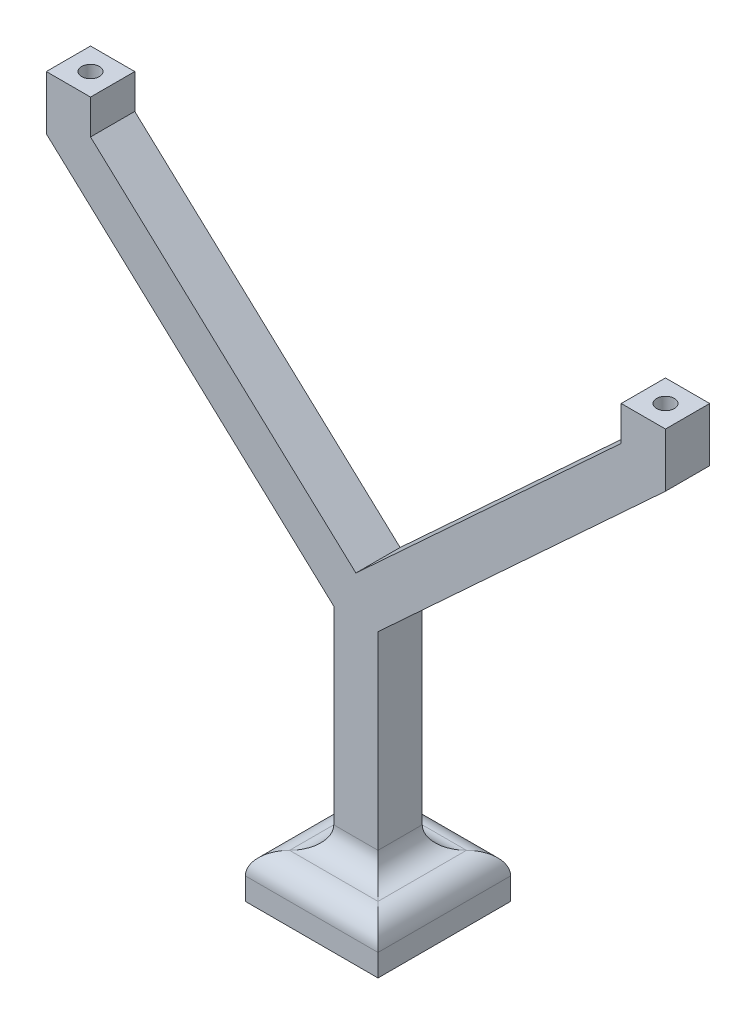
ISO-10303-21;
HEADER;
FILE_DESCRIPTION(('STEP AP214'),'2;1');
FILE_NAME('part.step','',(''),(''),'','','');
FILE_SCHEMA(('AUTOMOTIVE_DESIGN { 1 0 10303 214 1 1 1 1 }'));
ENDSEC;
DATA;
#1=APPLICATION_CONTEXT('core data for automotive mechanical design processes');
#2=APPLICATION_PROTOCOL_DEFINITION('international standard','automotive_design',2000,#1);
#3=PRODUCT_CONTEXT('',#1,'mechanical');
#4=PRODUCT('Part','Part','',(#3));
#5=PRODUCT_RELATED_PRODUCT_CATEGORY('part','',(#4));
#6=PRODUCT_DEFINITION_FORMATION('','',#4);
#7=PRODUCT_DEFINITION_CONTEXT('part definition',#1,'design');
#8=PRODUCT_DEFINITION('design','',#6,#7);
#9=PRODUCT_DEFINITION_SHAPE('','',#8);
#10=(LENGTH_UNIT() NAMED_UNIT(*) SI_UNIT(.MILLI.,.METRE.));
#11=(NAMED_UNIT(*) PLANE_ANGLE_UNIT() SI_UNIT($,.RADIAN.));
#12=(NAMED_UNIT(*) SI_UNIT($,.STERADIAN.) SOLID_ANGLE_UNIT());
#13=UNCERTAINTY_MEASURE_WITH_UNIT(LENGTH_MEASURE(1.E-05),#10,'distance_accuracy_value','');
#14=(GEOMETRIC_REPRESENTATION_CONTEXT(3) GLOBAL_UNCERTAINTY_ASSIGNED_CONTEXT((#13)) GLOBAL_UNIT_ASSIGNED_CONTEXT((#10,
#11,#12)) REPRESENTATION_CONTEXT('',''));
#15=CARTESIAN_POINT('',(0.,0.,0.));
#16=DIRECTION('',(0.,0.,1.));
#17=DIRECTION('',(1.,0.,0.));
#18=AXIS2_PLACEMENT_3D('',#15,#16,#17);
#19=CARTESIAN_POINT('',(-70.,117.810843841171,5.));
#20=DIRECTION('',(0.678280102733066,0.734803444627488,0.));
#21=DIRECTION('',(-0.734803444627488,0.678280102733066,0.));
#22=AXIS2_PLACEMENT_3D('',#19,#20,#21);
#23=PLANE('',#22);
#24=DIRECTION('',(0.,0.,-1.));
#25=VECTOR('',#24,1.);
#26=CARTESIAN_POINT('',(-5.,57.8108438411715,5.));
#27=LINE('',#26,#25);
#28=CARTESIAN_POINT('',(-5.,57.8108438411715,5.));
#29=VERTEX_POINT('',#28);
#30=CARTESIAN_POINT('',(-5.,57.8108438411715,-5.));
#31=VERTEX_POINT('',#30);
#32=EDGE_CURVE('E214',#29,#31,#27,.T.);
#33=ORIENTED_EDGE('',*,*,#32,.F.);
#34=DIRECTION('',(0.734803444627488,-0.678280102733066,0.));
#35=VECTOR('',#34,1.);
#36=CARTESIAN_POINT('',(-70.,117.810843841171,5.));
#37=LINE('',#36,#35);
#38=CARTESIAN_POINT('',(-70.,117.810843841171,5.));
#39=VERTEX_POINT('',#38);
#40=EDGE_CURVE('E226',#39,#29,#37,.T.);
#41=ORIENTED_EDGE('',*,*,#40,.F.);
#42=DIRECTION('',(0.,0.,-1.));
#43=VECTOR('',#42,1.);
#44=CARTESIAN_POINT('',(-70.,117.810843841171,5.));
#45=LINE('',#44,#43);
#46=CARTESIAN_POINT('',(-70.,117.810843841171,-5.));
#47=VERTEX_POINT('',#46);
#48=EDGE_CURVE('E284',#39,#47,#45,.T.);
#49=ORIENTED_EDGE('',*,*,#48,.T.);
#50=DIRECTION('',(0.734803444627488,-0.678280102733066,0.));
#51=VECTOR('',#50,1.);
#52=CARTESIAN_POINT('',(-70.,117.810843841171,-5.));
#53=LINE('',#52,#51);
#54=EDGE_CURVE('E248',#47,#31,#53,.T.);
#55=ORIENTED_EDGE('',*,*,#54,.T.);
#56=EDGE_LOOP('',(#33,#41,#49,#55));
#57=FACE_BOUND('',#56,.T.);
#58=ADVANCED_FACE('F33',(#57),#23,.F.);
#59=CARTESIAN_POINT('',(0.,53.1954592257869,5.));
#60=DIRECTION('',(-0.678280102733066,0.734803444627488,0.));
#61=DIRECTION('',(-0.734803444627488,-0.678280102733066,0.));
#62=AXIS2_PLACEMENT_3D('',#59,#60,#61);
#63=PLANE('',#62);
#64=DIRECTION('',(0.,0.,1.));
#65=VECTOR('',#64,1.);
#66=CARTESIAN_POINT('',(5.,57.8108438411715,5.));
#67=LINE('',#66,#65);
#68=CARTESIAN_POINT('',(5.,57.8108438411715,-5.));
#69=VERTEX_POINT('',#68);
#70=CARTESIAN_POINT('',(5.,57.8108438411715,5.));
#71=VERTEX_POINT('',#70);
#72=EDGE_CURVE('E216',#69,#71,#67,.T.);
#73=ORIENTED_EDGE('',*,*,#72,.F.);
#74=DIRECTION('',(0.734803444627488,0.678280102733066,0.));
#75=VECTOR('',#74,1.);
#76=CARTESIAN_POINT('',(0.,53.1954592257869,-5.));
#77=LINE('',#76,#75);
#78=CARTESIAN_POINT('',(70.,117.810843841172,-5.));
#79=VERTEX_POINT('',#78);
#80=EDGE_CURVE('E251',#69,#79,#77,.T.);
#81=ORIENTED_EDGE('',*,*,#80,.T.);
#82=DIRECTION('',(0.,0.,-1.));
#83=VECTOR('',#82,1.);
#84=CARTESIAN_POINT('',(70.,117.810843841172,5.));
#85=LINE('',#84,#83);
#86=CARTESIAN_POINT('',(70.,117.810843841172,5.));
#87=VERTEX_POINT('',#86);
#88=EDGE_CURVE('E281',#87,#79,#85,.T.);
#89=ORIENTED_EDGE('',*,*,#88,.F.);
#90=DIRECTION('',(0.734803444627488,0.678280102733066,0.));
#91=VECTOR('',#90,1.);
#92=CARTESIAN_POINT('',(0.,53.1954592257869,5.));
#93=LINE('',#92,#91);
#94=EDGE_CURVE('E229',#71,#87,#93,.T.);
#95=ORIENTED_EDGE('',*,*,#94,.F.);
#96=EDGE_LOOP('',(#73,#81,#89,#95));
#97=FACE_BOUND('',#96,.T.);
#98=ADVANCED_FACE('F400',(#97),#63,.F.);
#99=CARTESIAN_POINT('',(-70.,130.,5.));
#100=DIRECTION('',(0.,-1.,0.));
#101=DIRECTION('',(0.,0.,-1.));
#102=AXIS2_PLACEMENT_3D('',#99,#100,#101);
#103=PLANE('',#102);
#104=CARTESIAN_POINT('',(-65.,130.,0.));
#105=DIRECTION('',(0.,1.,0.));
#106=DIRECTION('',(0.,0.,1.));
#107=AXIS2_PLACEMENT_3D('',#104,#105,#106);
#108=CIRCLE('',#107,2.);
#109=CARTESIAN_POINT('',(-65.,130.,2.));
#110=VERTEX_POINT('',#109);
#111=EDGE_CURVE('E479',#110,#110,#108,.T.);
#112=ORIENTED_EDGE('',*,*,#111,.F.);
#113=EDGE_LOOP('',(#112));
#114=FACE_BOUND('',#113,.T.);
#115=DIRECTION('',(-1.,0.,0.));
#116=VECTOR('',#115,1.);
#117=CARTESIAN_POINT('',(-70.,130.,-5.));
#118=LINE('',#117,#116);
#119=CARTESIAN_POINT('',(-60.,130.,-5.));
#120=VERTEX_POINT('',#119);
#121=CARTESIAN_POINT('',(-70.,130.,-5.));
#122=VERTEX_POINT('',#121);
#123=EDGE_CURVE('E219',#120,#122,#118,.T.);
#124=ORIENTED_EDGE('',*,*,#123,.T.);
#125=DIRECTION('',(0.,0.,-1.));
#126=VECTOR('',#125,1.);
#127=CARTESIAN_POINT('',(-70.,130.,5.));
#128=LINE('',#127,#126);
#129=CARTESIAN_POINT('',(-70.,130.,5.));
#130=VERTEX_POINT('',#129);
#131=EDGE_CURVE('E287',#130,#122,#128,.T.);
#132=ORIENTED_EDGE('',*,*,#131,.F.);
#133=DIRECTION('',(-1.,0.,0.));
#134=VECTOR('',#133,1.);
#135=CARTESIAN_POINT('',(-70.,130.,5.));
#136=LINE('',#135,#134);
#137=CARTESIAN_POINT('',(-60.,130.,5.));
#138=VERTEX_POINT('',#137);
#139=EDGE_CURVE('E220',#138,#130,#136,.T.);
#140=ORIENTED_EDGE('',*,*,#139,.F.);
#141=DIRECTION('',(0.,0.,-1.));
#142=VECTOR('',#141,1.);
#143=CARTESIAN_POINT('',(-60.,130.,5.));
#144=LINE('',#143,#142);
#145=EDGE_CURVE('E243',#138,#120,#144,.T.);
#146=ORIENTED_EDGE('',*,*,#145,.T.);
#147=EDGE_LOOP('',(#124,#132,#140,#146));
#148=FACE_BOUND('',#147,.T.);
#149=ADVANCED_FACE('F366',(#114,#148),#103,.F.);
#150=CARTESIAN_POINT('',(-70.,130.,5.));
#151=DIRECTION('',(1.,0.,0.));
#152=DIRECTION('',(0.,0.,-1.));
#153=AXIS2_PLACEMENT_3D('',#150,#151,#152);
#154=PLANE('',#153);
#155=DIRECTION('',(0.,-1.,0.));
#156=VECTOR('',#155,1.);
#157=CARTESIAN_POINT('',(-70.,130.,-5.));
#158=LINE('',#157,#156);
#159=EDGE_CURVE('E246',#122,#47,#158,.T.);
#160=ORIENTED_EDGE('',*,*,#159,.T.);
#161=ORIENTED_EDGE('',*,*,#48,.F.);
#162=DIRECTION('',(0.,-1.,0.));
#163=VECTOR('',#162,1.);
#164=CARTESIAN_POINT('',(-70.,130.,5.));
#165=LINE('',#164,#163);
#166=EDGE_CURVE('E223',#130,#39,#165,.T.);
#167=ORIENTED_EDGE('',*,*,#166,.F.);
#168=ORIENTED_EDGE('',*,*,#131,.T.);
#169=EDGE_LOOP('',(#160,#161,#167,#168));
#170=FACE_BOUND('',#169,.T.);
#171=ADVANCED_FACE('F362',(#170),#154,.F.);
#172=CARTESIAN_POINT('',(70.,117.810843841172,5.));
#173=DIRECTION('',(-1.,0.,0.));
#174=DIRECTION('',(0.,0.,1.));
#175=AXIS2_PLACEMENT_3D('',#172,#173,#174);
#176=PLANE('',#175);
#177=DIRECTION('',(0.,1.,0.));
#178=VECTOR('',#177,1.);
#179=CARTESIAN_POINT('',(70.,117.810843841172,-5.));
#180=LINE('',#179,#178);
#181=CARTESIAN_POINT('',(70.,130.,-5.));
#182=VERTEX_POINT('',#181);
#183=EDGE_CURVE('E253',#79,#182,#180,.T.);
#184=ORIENTED_EDGE('',*,*,#183,.T.);
#185=DIRECTION('',(0.,0.,-1.));
#186=VECTOR('',#185,1.);
#187=CARTESIAN_POINT('',(70.,130.,5.));
#188=LINE('',#187,#186);
#189=CARTESIAN_POINT('',(70.,130.,5.));
#190=VERTEX_POINT('',#189);
#191=EDGE_CURVE('E278',#190,#182,#188,.T.);
#192=ORIENTED_EDGE('',*,*,#191,.F.);
#193=DIRECTION('',(0.,1.,0.));
#194=VECTOR('',#193,1.);
#195=CARTESIAN_POINT('',(70.,117.810843841172,5.));
#196=LINE('',#195,#194);
#197=EDGE_CURVE('E231',#87,#190,#196,.T.);
#198=ORIENTED_EDGE('',*,*,#197,.F.);
#199=ORIENTED_EDGE('',*,*,#88,.T.);
#200=EDGE_LOOP('',(#184,#192,#198,#199));
#201=FACE_BOUND('',#200,.T.);
#202=ADVANCED_FACE('F395',(#201),#176,.F.);
#203=CARTESIAN_POINT('',(60.,130.,5.));
#204=DIRECTION('',(0.,-1.,0.));
#205=DIRECTION('',(0.,0.,-1.));
#206=AXIS2_PLACEMENT_3D('',#203,#204,#205);
#207=PLANE('',#206);
#208=CARTESIAN_POINT('',(65.,130.,0.));
#209=DIRECTION('',(0.,1.,0.));
#210=DIRECTION('',(0.,0.,1.));
#211=AXIS2_PLACEMENT_3D('',#208,#209,#210);
#212=CIRCLE('',#211,2.);
#213=CARTESIAN_POINT('',(65.,130.,2.));
#214=VERTEX_POINT('',#213);
#215=EDGE_CURVE('E487',#214,#214,#212,.T.);
#216=ORIENTED_EDGE('',*,*,#215,.F.);
#217=EDGE_LOOP('',(#216));
#218=FACE_BOUND('',#217,.T.);
#219=DIRECTION('',(-1.,0.,0.));
#220=VECTOR('',#219,1.);
#221=CARTESIAN_POINT('',(60.,130.,-5.));
#222=LINE('',#221,#220);
#223=CARTESIAN_POINT('',(60.,130.,-5.));
#224=VERTEX_POINT('',#223);
#225=EDGE_CURVE('E255',#182,#224,#222,.T.);
#226=ORIENTED_EDGE('',*,*,#225,.T.);
#227=DIRECTION('',(0.,0.,-1.));
#228=VECTOR('',#227,1.);
#229=CARTESIAN_POINT('',(60.,130.,5.));
#230=LINE('',#229,#228);
#231=CARTESIAN_POINT('',(60.,130.,5.));
#232=VERTEX_POINT('',#231);
#233=EDGE_CURVE('E275',#232,#224,#230,.T.);
#234=ORIENTED_EDGE('',*,*,#233,.F.);
#235=DIRECTION('',(-1.,0.,0.));
#236=VECTOR('',#235,1.);
#237=CARTESIAN_POINT('',(60.,130.,5.));
#238=LINE('',#237,#236);
#239=EDGE_CURVE('E233',#190,#232,#238,.T.);
#240=ORIENTED_EDGE('',*,*,#239,.F.);
#241=ORIENTED_EDGE('',*,*,#191,.T.);
#242=EDGE_LOOP('',(#226,#234,#240,#241));
#243=FACE_BOUND('',#242,.T.);
#244=ADVANCED_FACE('F390',(#218,#243),#207,.F.);
#245=CARTESIAN_POINT('',(60.,122.189156158829,5.));
#246=DIRECTION('',(1.,0.,0.));
#247=DIRECTION('',(0.,0.,-1.));
#248=AXIS2_PLACEMENT_3D('',#245,#246,#247);
#249=PLANE('',#248);
#250=DIRECTION('',(0.,-1.,0.));
#251=VECTOR('',#250,1.);
#252=CARTESIAN_POINT('',(60.,122.189156158829,-5.));
#253=LINE('',#252,#251);
#254=CARTESIAN_POINT('',(60.,122.189156158829,-5.));
#255=VERTEX_POINT('',#254);
#256=EDGE_CURVE('E257',#224,#255,#253,.T.);
#257=ORIENTED_EDGE('',*,*,#256,.T.);
#258=DIRECTION('',(0.,0.,-1.));
#259=VECTOR('',#258,1.);
#260=CARTESIAN_POINT('',(60.,122.189156158829,5.));
#261=LINE('',#260,#259);
#262=CARTESIAN_POINT('',(60.,122.189156158829,5.));
#263=VERTEX_POINT('',#262);
#264=EDGE_CURVE('E272',#263,#255,#261,.T.);
#265=ORIENTED_EDGE('',*,*,#264,.F.);
#266=DIRECTION('',(0.,-1.,0.));
#267=VECTOR('',#266,1.);
#268=CARTESIAN_POINT('',(60.,122.189156158829,5.));
#269=LINE('',#268,#267);
#270=EDGE_CURVE('E235',#232,#263,#269,.T.);
#271=ORIENTED_EDGE('',*,*,#270,.F.);
#272=ORIENTED_EDGE('',*,*,#233,.T.);
#273=EDGE_LOOP('',(#257,#265,#271,#272));
#274=FACE_BOUND('',#273,.T.);
#275=ADVANCED_FACE('F385',(#274),#249,.F.);
#276=CARTESIAN_POINT('',(0.,66.8045407742131,5.));
#277=DIRECTION('',(0.678280102733066,-0.734803444627488,0.));
#278=DIRECTION('',(0.734803444627488,0.678280102733066,0.));
#279=AXIS2_PLACEMENT_3D('',#276,#277,#278);
#280=PLANE('',#279);
#281=DIRECTION('',(-0.734803444627488,-0.678280102733066,0.));
#282=VECTOR('',#281,1.);
#283=CARTESIAN_POINT('',(0.,66.8045407742131,-5.));
#284=LINE('',#283,#282);
#285=CARTESIAN_POINT('',(0.,66.8045407742131,-5.));
#286=VERTEX_POINT('',#285);
#287=EDGE_CURVE('E259',#255,#286,#284,.T.);
#288=ORIENTED_EDGE('',*,*,#287,.T.);
#289=DIRECTION('',(0.,0.,-1.));
#290=VECTOR('',#289,1.);
#291=CARTESIAN_POINT('',(0.,66.8045407742131,5.));
#292=LINE('',#291,#290);
#293=CARTESIAN_POINT('',(0.,66.8045407742131,5.));
#294=VERTEX_POINT('',#293);
#295=EDGE_CURVE('E269',#294,#286,#292,.T.);
#296=ORIENTED_EDGE('',*,*,#295,.F.);
#297=DIRECTION('',(-0.734803444627488,-0.678280102733066,0.));
#298=VECTOR('',#297,1.);
#299=CARTESIAN_POINT('',(0.,66.8045407742131,5.));
#300=LINE('',#299,#298);
#301=EDGE_CURVE('E237',#263,#294,#300,.T.);
#302=ORIENTED_EDGE('',*,*,#301,.F.);
#303=ORIENTED_EDGE('',*,*,#264,.T.);
#304=EDGE_LOOP('',(#288,#296,#302,#303));
#305=FACE_BOUND('',#304,.T.);
#306=ADVANCED_FACE('F381',(#305),#280,.F.);
#307=CARTESIAN_POINT('',(-60.,122.189156158829,5.));
#308=DIRECTION('',(-0.678280102733066,-0.734803444627488,0.));
#309=DIRECTION('',(0.734803444627488,-0.678280102733066,0.));
#310=AXIS2_PLACEMENT_3D('',#307,#308,#309);
#311=PLANE('',#310);
#312=DIRECTION('',(-0.734803444627488,0.678280102733066,0.));
#313=VECTOR('',#312,1.);
#314=CARTESIAN_POINT('',(-60.,122.189156158829,-5.));
#315=LINE('',#314,#313);
#316=CARTESIAN_POINT('',(-60.,122.189156158829,-5.));
#317=VERTEX_POINT('',#316);
#318=EDGE_CURVE('E261',#286,#317,#315,.T.);
#319=ORIENTED_EDGE('',*,*,#318,.T.);
#320=DIRECTION('',(0.,0.,-1.));
#321=VECTOR('',#320,1.);
#322=CARTESIAN_POINT('',(-60.,122.189156158829,5.));
#323=LINE('',#322,#321);
#324=CARTESIAN_POINT('',(-60.,122.189156158829,5.));
#325=VERTEX_POINT('',#324);
#326=EDGE_CURVE('E266',#325,#317,#323,.T.);
#327=ORIENTED_EDGE('',*,*,#326,.F.);
#328=DIRECTION('',(-0.734803444627488,0.678280102733066,0.));
#329=VECTOR('',#328,1.);
#330=CARTESIAN_POINT('',(-60.,122.189156158829,5.));
#331=LINE('',#330,#329);
#332=EDGE_CURVE('E239',#294,#325,#331,.T.);
#333=ORIENTED_EDGE('',*,*,#332,.F.);
#334=ORIENTED_EDGE('',*,*,#295,.T.);
#335=EDGE_LOOP('',(#319,#327,#333,#334));
#336=FACE_BOUND('',#335,.T.);
#337=ADVANCED_FACE('F376',(#336),#311,.F.);
#338=CARTESIAN_POINT('',(-60.,130.,5.));
#339=DIRECTION('',(-1.,0.,0.));
#340=DIRECTION('',(0.,0.,1.));
#341=AXIS2_PLACEMENT_3D('',#338,#339,#340);
#342=PLANE('',#341);
#343=DIRECTION('',(0.,1.,0.));
#344=VECTOR('',#343,1.);
#345=CARTESIAN_POINT('',(-60.,130.,-5.));
#346=LINE('',#345,#344);
#347=EDGE_CURVE('E224',#317,#120,#346,.T.);
#348=ORIENTED_EDGE('',*,*,#347,.T.);
#349=ORIENTED_EDGE('',*,*,#145,.F.);
#350=DIRECTION('',(0.,1.,0.));
#351=VECTOR('',#350,1.);
#352=CARTESIAN_POINT('',(-60.,130.,5.));
#353=LINE('',#352,#351);
#354=EDGE_CURVE('E241',#325,#138,#353,.T.);
#355=ORIENTED_EDGE('',*,*,#354,.F.);
#356=ORIENTED_EDGE('',*,*,#326,.T.);
#357=EDGE_LOOP('',(#348,#349,#355,#356));
#358=FACE_BOUND('',#357,.T.);
#359=ADVANCED_FACE('F370',(#358),#342,.F.);
#360=CARTESIAN_POINT('',(0.,0.,5.));
#361=DIRECTION('',(0.,0.,-1.));
#362=DIRECTION('',(-1.,0.,0.));
#363=AXIS2_PLACEMENT_3D('',#360,#361,#362);
#364=PLANE('',#363);
#365=DIRECTION('',(0.,-1.,0.));
#366=VECTOR('',#365,1.);
#367=CARTESIAN_POINT('',(-5.,66.8045407742131,5.));
#368=LINE('',#367,#366);
#369=CARTESIAN_POINT('',(-5.,15.,5.));
#370=VERTEX_POINT('',#369);
#371=EDGE_CURVE('E205',#29,#370,#368,.T.);
#372=ORIENTED_EDGE('',*,*,#371,.T.);
#373=DIRECTION('',(1.,0.,0.));
#374=VECTOR('',#373,1.);
#375=CARTESIAN_POINT('',(0.,15.,5.));
#376=LINE('',#375,#374);
#377=CARTESIAN_POINT('',(5.,15.,5.));
#378=VERTEX_POINT('',#377);
#379=EDGE_CURVE('E295',#370,#378,#376,.T.);
#380=ORIENTED_EDGE('',*,*,#379,.T.);
#381=DIRECTION('',(0.,-1.,0.));
#382=VECTOR('',#381,1.);
#383=CARTESIAN_POINT('',(5.,66.8045407742131,5.));
#384=LINE('',#383,#382);
#385=EDGE_CURVE('E202',#71,#378,#384,.T.);
#386=ORIENTED_EDGE('',*,*,#385,.F.);
#387=ORIENTED_EDGE('',*,*,#94,.T.);
#388=ORIENTED_EDGE('',*,*,#197,.T.);
#389=ORIENTED_EDGE('',*,*,#239,.T.);
#390=ORIENTED_EDGE('',*,*,#270,.T.);
#391=ORIENTED_EDGE('',*,*,#301,.T.);
#392=ORIENTED_EDGE('',*,*,#332,.T.);
#393=ORIENTED_EDGE('',*,*,#354,.T.);
#394=ORIENTED_EDGE('',*,*,#139,.T.);
#395=ORIENTED_EDGE('',*,*,#166,.T.);
#396=ORIENTED_EDGE('',*,*,#40,.T.);
#397=EDGE_LOOP('',(#372,#380,#386,#387,#388,#389,#390,#391,#392,#393,#394,#395,#396));
#398=FACE_BOUND('',#397,.T.);
#399=ADVANCED_FACE('F357',(#398),#364,.F.);
#400=CARTESIAN_POINT('',(0.,0.,-5.));
#401=DIRECTION('',(0.,0.,-1.));
#402=DIRECTION('',(-1.,0.,0.));
#403=AXIS2_PLACEMENT_3D('',#400,#401,#402);
#404=PLANE('',#403);
#405=DIRECTION('',(0.,-1.,0.));
#406=VECTOR('',#405,1.);
#407=CARTESIAN_POINT('',(5.,66.8045407742131,-5.));
#408=LINE('',#407,#406);
#409=CARTESIAN_POINT('',(5.,15.,-5.));
#410=VERTEX_POINT('',#409);
#411=EDGE_CURVE('E211',#69,#410,#408,.T.);
#412=ORIENTED_EDGE('',*,*,#411,.T.);
#413=DIRECTION('',(1.,0.,0.));
#414=VECTOR('',#413,1.);
#415=CARTESIAN_POINT('',(-5.,15.,-5.));
#416=LINE('',#415,#414);
#417=CARTESIAN_POINT('',(-5.,15.,-5.));
#418=VERTEX_POINT('',#417);
#419=EDGE_CURVE('E290',#410,#418,#416,.F.);
#420=ORIENTED_EDGE('',*,*,#419,.T.);
#421=DIRECTION('',(0.,-1.,0.));
#422=VECTOR('',#421,1.);
#423=CARTESIAN_POINT('',(-5.,66.8045407742131,-5.));
#424=LINE('',#423,#422);
#425=EDGE_CURVE('E208',#31,#418,#424,.T.);
#426=ORIENTED_EDGE('',*,*,#425,.F.);
#427=ORIENTED_EDGE('',*,*,#54,.F.);
#428=ORIENTED_EDGE('',*,*,#159,.F.);
#429=ORIENTED_EDGE('',*,*,#123,.F.);
#430=ORIENTED_EDGE('',*,*,#347,.F.);
#431=ORIENTED_EDGE('',*,*,#318,.F.);
#432=ORIENTED_EDGE('',*,*,#287,.F.);
#433=ORIENTED_EDGE('',*,*,#256,.F.);
#434=ORIENTED_EDGE('',*,*,#225,.F.);
#435=ORIENTED_EDGE('',*,*,#183,.F.);
#436=ORIENTED_EDGE('',*,*,#80,.F.);
#437=EDGE_LOOP('',(#412,#420,#426,#427,#428,#429,#430,#431,#432,#433,#434,#435,#436));
#438=FACE_BOUND('',#437,.T.);
#439=ADVANCED_FACE('F348',(#438),#404,.T.);
#440=CARTESIAN_POINT('',(5.,66.8045407742131,5.));
#441=DIRECTION('',(-1.,0.,0.));
#442=DIRECTION('',(0.,0.,1.));
#443=AXIS2_PLACEMENT_3D('',#440,#441,#442);
#444=PLANE('',#443);
#445=ORIENTED_EDGE('',*,*,#385,.T.);
#446=DIRECTION('',(0.,0.,-1.));
#447=VECTOR('',#446,1.);
#448=CARTESIAN_POINT('',(5.,15.,5.));
#449=LINE('',#448,#447);
#450=EDGE_CURVE('E188',#378,#410,#449,.T.);
#451=ORIENTED_EDGE('',*,*,#450,.T.);
#452=ORIENTED_EDGE('',*,*,#411,.F.);
#453=ORIENTED_EDGE('',*,*,#72,.T.);
#454=EDGE_LOOP('',(#445,#451,#452,#453));
#455=FACE_BOUND('',#454,.T.);
#456=ADVANCED_FACE('F402',(#455),#444,.F.);
#457=CARTESIAN_POINT('',(-5.,66.8045407742131,5.));
#458=DIRECTION('',(1.,0.,0.));
#459=DIRECTION('',(0.,0.,-1.));
#460=AXIS2_PLACEMENT_3D('',#457,#458,#459);
#461=PLANE('',#460);
#462=ORIENTED_EDGE('',*,*,#425,.T.);
#463=DIRECTION('',(0.,0.,1.));
#464=VECTOR('',#463,1.);
#465=CARTESIAN_POINT('',(-5.,15.,5.));
#466=LINE('',#465,#464);
#467=EDGE_CURVE('E293',#418,#370,#466,.T.);
#468=ORIENTED_EDGE('',*,*,#467,.T.);
#469=ORIENTED_EDGE('',*,*,#371,.F.);
#470=ORIENTED_EDGE('',*,*,#32,.T.);
#471=EDGE_LOOP('',(#462,#468,#469,#470));
#472=FACE_BOUND('',#471,.T.);
#473=ADVANCED_FACE('F352',(#472),#461,.F.);
#474=CARTESIAN_POINT('',(15.,10.,-15.));
#475=DIRECTION('',(1.,0.,0.));
#476=DIRECTION('',(0.,0.,-1.));
#477=AXIS2_PLACEMENT_3D('',#474,#475,#476);
#478=PLANE('',#477);
#479=DIRECTION('',(0.,-1.,0.));
#480=VECTOR('',#479,1.);
#481=CARTESIAN_POINT('',(15.,10.,-15.));
#482=LINE('',#481,#480);
#483=CARTESIAN_POINT('',(15.,5.,-15.));
#484=VERTEX_POINT('',#483);
#485=CARTESIAN_POINT('',(15.,0.,-15.));
#486=VERTEX_POINT('',#485);
#487=EDGE_CURVE('E196',#484,#486,#482,.T.);
#488=ORIENTED_EDGE('',*,*,#487,.F.);
#489=DIRECTION('',(0.,0.,1.));
#490=VECTOR('',#489,1.);
#491=CARTESIAN_POINT('',(15.,5.,-15.));
#492=LINE('',#491,#490);
#493=CARTESIAN_POINT('',(15.,5.,15.));
#494=VERTEX_POINT('',#493);
#495=EDGE_CURVE('E11',#484,#494,#492,.T.);
#496=ORIENTED_EDGE('',*,*,#495,.T.);
#497=DIRECTION('',(0.,-1.,0.));
#498=VECTOR('',#497,1.);
#499=CARTESIAN_POINT('',(15.,10.,15.));
#500=LINE('',#499,#498);
#501=CARTESIAN_POINT('',(15.,0.,15.));
#502=VERTEX_POINT('',#501);
#503=EDGE_CURVE('E82',#494,#502,#500,.T.);
#504=ORIENTED_EDGE('',*,*,#503,.T.);
#505=DIRECTION('',(0.,0.,1.));
#506=VECTOR('',#505,1.);
#507=CARTESIAN_POINT('',(15.,0.,-15.));
#508=LINE('',#507,#506);
#509=EDGE_CURVE('E183',#486,#502,#508,.T.);
#510=ORIENTED_EDGE('',*,*,#509,.F.);
#511=EDGE_LOOP('',(#488,#496,#504,#510));
#512=FACE_BOUND('',#511,.T.);
#513=ADVANCED_FACE('F409',(#512),#478,.T.);
#514=CARTESIAN_POINT('',(-15.,10.,-15.));
#515=DIRECTION('',(0.,0.,-1.));
#516=DIRECTION('',(-1.,0.,0.));
#517=AXIS2_PLACEMENT_3D('',#514,#515,#516);
#518=PLANE('',#517);
#519=DIRECTION('',(0.,-1.,0.));
#520=VECTOR('',#519,1.);
#521=CARTESIAN_POINT('',(-15.,10.,-15.));
#522=LINE('',#521,#520);
#523=CARTESIAN_POINT('',(-15.,5.,-15.));
#524=VERTEX_POINT('',#523);
#525=CARTESIAN_POINT('',(-15.,0.,-15.));
#526=VERTEX_POINT('',#525);
#527=EDGE_CURVE('E194',#524,#526,#522,.T.);
#528=ORIENTED_EDGE('',*,*,#527,.F.);
#529=DIRECTION('',(1.,0.,0.));
#530=VECTOR('',#529,1.);
#531=CARTESIAN_POINT('',(-15.,5.,-15.));
#532=LINE('',#531,#530);
#533=EDGE_CURVE('E43',#524,#484,#532,.T.);
#534=ORIENTED_EDGE('',*,*,#533,.T.);
#535=ORIENTED_EDGE('',*,*,#487,.T.);
#536=DIRECTION('',(1.,0.,0.));
#537=VECTOR('',#536,1.);
#538=CARTESIAN_POINT('',(-15.,0.,-15.));
#539=LINE('',#538,#537);
#540=EDGE_CURVE('E198',#526,#486,#539,.T.);
#541=ORIENTED_EDGE('',*,*,#540,.F.);
#542=EDGE_LOOP('',(#528,#534,#535,#541));
#543=FACE_BOUND('',#542,.T.);
#544=ADVANCED_FACE('F455',(#543),#518,.T.);
#545=CARTESIAN_POINT('',(-15.,10.,-15.));
#546=DIRECTION('',(-1.,0.,0.));
#547=DIRECTION('',(0.,0.,1.));
#548=AXIS2_PLACEMENT_3D('',#545,#546,#547);
#549=PLANE('',#548);
#550=DIRECTION('',(0.,-1.,0.));
#551=VECTOR('',#550,1.);
#552=CARTESIAN_POINT('',(-15.,10.,15.));
#553=LINE('',#552,#551);
#554=CARTESIAN_POINT('',(-15.,5.,15.));
#555=VERTEX_POINT('',#554);
#556=CARTESIAN_POINT('',(-15.,0.,15.));
#557=VERTEX_POINT('',#556);
#558=EDGE_CURVE('E186',#555,#557,#553,.T.);
#559=ORIENTED_EDGE('',*,*,#558,.F.);
#560=DIRECTION('',(0.,0.,-1.));
#561=VECTOR('',#560,1.);
#562=CARTESIAN_POINT('',(-15.,5.,-15.));
#563=LINE('',#562,#561);
#564=EDGE_CURVE('E172',#555,#524,#563,.T.);
#565=ORIENTED_EDGE('',*,*,#564,.T.);
#566=ORIENTED_EDGE('',*,*,#527,.T.);
#567=DIRECTION('',(0.,0.,-1.));
#568=VECTOR('',#567,1.);
#569=CARTESIAN_POINT('',(-15.,0.,-15.));
#570=LINE('',#569,#568);
#571=EDGE_CURVE('E192',#557,#526,#570,.T.);
#572=ORIENTED_EDGE('',*,*,#571,.F.);
#573=EDGE_LOOP('',(#559,#565,#566,#572));
#574=FACE_BOUND('',#573,.T.);
#575=ADVANCED_FACE('F190',(#574),#549,.T.);
#576=CARTESIAN_POINT('',(-15.,10.,15.));
#577=DIRECTION('',(0.,0.,1.));
#578=DIRECTION('',(1.,0.,0.));
#579=AXIS2_PLACEMENT_3D('',#576,#577,#578);
#580=PLANE('',#579);
#581=ORIENTED_EDGE('',*,*,#503,.F.);
#582=DIRECTION('',(-1.,0.,0.));
#583=VECTOR('',#582,1.);
#584=CARTESIAN_POINT('',(-15.,5.,15.));
#585=LINE('',#584,#583);
#586=EDGE_CURVE('E178',#494,#555,#585,.T.);
#587=ORIENTED_EDGE('',*,*,#586,.T.);
#588=ORIENTED_EDGE('',*,*,#558,.T.);
#589=DIRECTION('',(-1.,0.,0.));
#590=VECTOR('',#589,1.);
#591=CARTESIAN_POINT('',(-15.,0.,15.));
#592=LINE('',#591,#590);
#593=EDGE_CURVE('E491',#502,#557,#592,.T.);
#594=ORIENTED_EDGE('',*,*,#593,.F.);
#595=EDGE_LOOP('',(#581,#587,#588,#594));
#596=FACE_BOUND('',#595,.T.);
#597=ADVANCED_FACE('F185',(#596),#580,.T.);
#598=CARTESIAN_POINT('',(0.,0.,0.));
#599=DIRECTION('',(0.,-1.,0.));
#600=DIRECTION('',(0.,0.,-1.));
#601=AXIS2_PLACEMENT_3D('',#598,#599,#600);
#602=PLANE('',#601);
#603=ORIENTED_EDGE('',*,*,#509,.T.);
#604=ORIENTED_EDGE('',*,*,#593,.T.);
#605=ORIENTED_EDGE('',*,*,#571,.T.);
#606=ORIENTED_EDGE('',*,*,#540,.T.);
#607=EDGE_LOOP('',(#603,#604,#605,#606));
#608=FACE_BOUND('',#607,.T.);
#609=ADVANCED_FACE('F442',(#608),#602,.T.);
#610=CARTESIAN_POINT('',(-15.,5.,9.99999999999999));
#611=DIRECTION('',(-1.,0.,0.));
#612=DIRECTION('',(0.,0.,1.));
#613=AXIS2_PLACEMENT_3D('',#610,#611,#612);
#614=CYLINDRICAL_SURFACE('',#613,5.);
#615=CARTESIAN_POINT('',(-10.,5.,9.99999999999999));
#616=DIRECTION('',(-0.707106781186547,0.,-0.707106781186548));
#617=DIRECTION('',(0.707106781186548,0.,-0.707106781186547));
#618=AXIS2_PLACEMENT_3D('',#615,#616,#617);
#619=ELLIPSE('',#618,7.07106781186548,5.);
#620=CARTESIAN_POINT('',(-10.,10.,10.));
#621=VERTEX_POINT('',#620);
#622=EDGE_CURVE('E37',#555,#621,#619,.T.);
#623=ORIENTED_EDGE('',*,*,#622,.F.);
#624=ORIENTED_EDGE('',*,*,#586,.F.);
#625=CARTESIAN_POINT('',(9.99999999999999,5.,10.));
#626=DIRECTION('',(-0.707106781186548,0.,0.707106781186547));
#627=DIRECTION('',(0.707106781186547,0.,0.707106781186548));
#628=AXIS2_PLACEMENT_3D('',#625,#626,#627);
#629=ELLIPSE('',#628,7.07106781186547,5.);
#630=CARTESIAN_POINT('',(10.,10.,10.));
#631=VERTEX_POINT('',#630);
#632=EDGE_CURVE('E69',#631,#494,#629,.F.);
#633=ORIENTED_EDGE('',*,*,#632,.F.);
#634=DIRECTION('',(-1.,0.,0.));
#635=VECTOR('',#634,1.);
#636=CARTESIAN_POINT('',(0.,10.,10.));
#637=LINE('',#636,#635);
#638=EDGE_CURVE('E181',#621,#631,#637,.F.);
#639=ORIENTED_EDGE('',*,*,#638,.F.);
#640=EDGE_LOOP('',(#623,#624,#633,#639));
#641=FACE_BOUND('',#640,.T.);
#642=ADVANCED_FACE('F35',(#641),#614,.T.);
#643=CARTESIAN_POINT('',(-9.99999999999999,5.,-15.));
#644=DIRECTION('',(0.,0.,-1.));
#645=DIRECTION('',(-1.,0.,0.));
#646=AXIS2_PLACEMENT_3D('',#643,#644,#645);
#647=CYLINDRICAL_SURFACE('',#646,5.);
#648=ORIENTED_EDGE('',*,*,#564,.F.);
#649=ORIENTED_EDGE('',*,*,#622,.T.);
#650=DIRECTION('',(0.,0.,-1.));
#651=VECTOR('',#650,1.);
#652=CARTESIAN_POINT('',(-10.,10.,0.));
#653=LINE('',#652,#651);
#654=CARTESIAN_POINT('',(-10.,10.,-10.));
#655=VERTEX_POINT('',#654);
#656=EDGE_CURVE('E318',#655,#621,#653,.F.);
#657=ORIENTED_EDGE('',*,*,#656,.F.);
#658=CARTESIAN_POINT('',(-9.99999999999999,5.,-10.));
#659=DIRECTION('',(0.707106781186548,0.,-0.707106781186547));
#660=DIRECTION('',(0.707106781186547,0.,0.707106781186548));
#661=AXIS2_PLACEMENT_3D('',#658,#659,#660);
#662=ELLIPSE('',#661,7.07106781186547,5.);
#663=EDGE_CURVE('E175',#524,#655,#662,.T.);
#664=ORIENTED_EDGE('',*,*,#663,.F.);
#665=EDGE_LOOP('',(#648,#649,#657,#664));
#666=FACE_BOUND('',#665,.T.);
#667=ADVANCED_FACE('F173',(#666),#647,.T.);
#668=CARTESIAN_POINT('',(9.99999999999999,5.,-15.));
#669=DIRECTION('',(0.,0.,1.));
#670=DIRECTION('',(1.,0.,0.));
#671=AXIS2_PLACEMENT_3D('',#668,#669,#670);
#672=CYLINDRICAL_SURFACE('',#671,5.);
#673=ORIENTED_EDGE('',*,*,#632,.T.);
#674=ORIENTED_EDGE('',*,*,#495,.F.);
#675=CARTESIAN_POINT('',(9.99999999999999,5.,-10.));
#676=DIRECTION('',(0.707106781186547,0.,0.707106781186548));
#677=DIRECTION('',(-0.707106781186548,0.,0.707106781186547));
#678=AXIS2_PLACEMENT_3D('',#675,#676,#677);
#679=ELLIPSE('',#678,7.07106781186547,5.);
#680=CARTESIAN_POINT('',(10.,10.,-10.));
#681=VERTEX_POINT('',#680);
#682=EDGE_CURVE('E314',#681,#484,#679,.F.);
#683=ORIENTED_EDGE('',*,*,#682,.F.);
#684=DIRECTION('',(0.,0.,1.));
#685=VECTOR('',#684,1.);
#686=CARTESIAN_POINT('',(9.99999999999999,10.,0.));
#687=LINE('',#686,#685);
#688=EDGE_CURVE('E311',#631,#681,#687,.F.);
#689=ORIENTED_EDGE('',*,*,#688,.F.);
#690=EDGE_LOOP('',(#673,#674,#683,#689));
#691=FACE_BOUND('',#690,.T.);
#692=ADVANCED_FACE('F327',(#691),#672,.T.);
#693=CARTESIAN_POINT('',(0.,15.,10.));
#694=DIRECTION('',(1.,0.,0.));
#695=DIRECTION('',(0.,0.,-1.));
#696=AXIS2_PLACEMENT_3D('',#693,#694,#695);
#697=CYLINDRICAL_SURFACE('',#696,5.);
#698=CARTESIAN_POINT('',(10.,15.,10.));
#699=DIRECTION('',(0.707106781186547,0.,-0.707106781186547));
#700=DIRECTION('',(-0.707106781186547,0.,-0.707106781186547));
#701=AXIS2_PLACEMENT_3D('',#698,#699,#700);
#702=ELLIPSE('',#701,7.07106781186547,5.);
#703=EDGE_CURVE('E308',#378,#631,#702,.F.);
#704=ORIENTED_EDGE('',*,*,#703,.F.);
#705=ORIENTED_EDGE('',*,*,#379,.F.);
#706=CARTESIAN_POINT('',(-10.,15.,10.));
#707=DIRECTION('',(0.707106781186547,0.,0.707106781186547));
#708=DIRECTION('',(0.707106781186547,0.,-0.707106781186547));
#709=AXIS2_PLACEMENT_3D('',#706,#707,#708);
#710=ELLIPSE('',#709,7.07106781186547,5.);
#711=EDGE_CURVE('E321',#621,#370,#710,.T.);
#712=ORIENTED_EDGE('',*,*,#711,.F.);
#713=ORIENTED_EDGE('',*,*,#638,.T.);
#714=EDGE_LOOP('',(#704,#705,#712,#713));
#715=FACE_BOUND('',#714,.T.);
#716=ADVANCED_FACE('F336',(#715),#697,.F.);
#717=CARTESIAN_POINT('',(-10.,15.,5.));
#718=DIRECTION('',(0.,0.,1.));
#719=DIRECTION('',(1.,0.,0.));
#720=AXIS2_PLACEMENT_3D('',#717,#718,#719);
#721=CYLINDRICAL_SURFACE('',#720,5.);
#722=ORIENTED_EDGE('',*,*,#711,.T.);
#723=ORIENTED_EDGE('',*,*,#467,.F.);
#724=CARTESIAN_POINT('',(-10.,15.,-10.));
#725=DIRECTION('',(-0.707106781186547,0.,0.707106781186547));
#726=DIRECTION('',(0.707106781186547,0.,0.707106781186547));
#727=AXIS2_PLACEMENT_3D('',#724,#725,#726);
#728=ELLIPSE('',#727,7.07106781186547,5.);
#729=EDGE_CURVE('E306',#655,#418,#728,.T.);
#730=ORIENTED_EDGE('',*,*,#729,.F.);
#731=ORIENTED_EDGE('',*,*,#656,.T.);
#732=EDGE_LOOP('',(#722,#723,#730,#731));
#733=FACE_BOUND('',#732,.T.);
#734=ADVANCED_FACE('F340',(#733),#721,.F.);
#735=CARTESIAN_POINT('',(-15.,5.,-10.));
#736=DIRECTION('',(1.,0.,0.));
#737=DIRECTION('',(0.,0.,-1.));
#738=AXIS2_PLACEMENT_3D('',#735,#736,#737);
#739=CYLINDRICAL_SURFACE('',#738,5.);
#740=ORIENTED_EDGE('',*,*,#533,.F.);
#741=ORIENTED_EDGE('',*,*,#663,.T.);
#742=DIRECTION('',(1.,0.,0.));
#743=VECTOR('',#742,1.);
#744=CARTESIAN_POINT('',(0.,10.,-10.));
#745=LINE('',#744,#743);
#746=EDGE_CURVE('E302',#681,#655,#745,.F.);
#747=ORIENTED_EDGE('',*,*,#746,.F.);
#748=ORIENTED_EDGE('',*,*,#682,.T.);
#749=EDGE_LOOP('',(#740,#741,#747,#748));
#750=FACE_BOUND('',#749,.T.);
#751=ADVANCED_FACE('F342',(#750),#739,.T.);
#752=CARTESIAN_POINT('',(10.,15.,5.));
#753=DIRECTION('',(0.,0.,-1.));
#754=DIRECTION('',(-1.,0.,0.));
#755=AXIS2_PLACEMENT_3D('',#752,#753,#754);
#756=CYLINDRICAL_SURFACE('',#755,5.);
#757=ORIENTED_EDGE('',*,*,#703,.T.);
#758=ORIENTED_EDGE('',*,*,#688,.T.);
#759=CARTESIAN_POINT('',(10.,15.,-10.));
#760=DIRECTION('',(-0.707106781186547,0.,-0.707106781186547));
#761=DIRECTION('',(0.707106781186547,0.,-0.707106781186547));
#762=AXIS2_PLACEMENT_3D('',#759,#760,#761);
#763=ELLIPSE('',#762,7.07106781186547,5.);
#764=EDGE_CURVE('E299',#410,#681,#763,.F.);
#765=ORIENTED_EDGE('',*,*,#764,.F.);
#766=ORIENTED_EDGE('',*,*,#450,.F.);
#767=EDGE_LOOP('',(#757,#758,#765,#766));
#768=FACE_BOUND('',#767,.T.);
#769=ADVANCED_FACE('F333',(#768),#756,.F.);
#770=CARTESIAN_POINT('',(0.,15.,-10.));
#771=DIRECTION('',(-1.,0.,0.));
#772=DIRECTION('',(0.,0.,1.));
#773=AXIS2_PLACEMENT_3D('',#770,#771,#772);
#774=CYLINDRICAL_SURFACE('',#773,5.);
#775=ORIENTED_EDGE('',*,*,#729,.T.);
#776=ORIENTED_EDGE('',*,*,#419,.F.);
#777=ORIENTED_EDGE('',*,*,#764,.T.);
#778=ORIENTED_EDGE('',*,*,#746,.T.);
#779=EDGE_LOOP('',(#775,#776,#777,#778));
#780=FACE_BOUND('',#779,.T.);
#781=ADVANCED_FACE('F345',(#780),#774,.F.);
#782=CARTESIAN_POINT('',(65.,126.,0.));
#783=DIRECTION('',(0.,1.,0.));
#784=DIRECTION('',(0.,0.,1.));
#785=AXIS2_PLACEMENT_3D('',#782,#783,#784);
#786=CYLINDRICAL_SURFACE('',#785,2.);
#787=CARTESIAN_POINT('',(65.,126.,0.));
#788=DIRECTION('',(0.,1.,0.));
#789=DIRECTION('',(0.,0.,1.));
#790=AXIS2_PLACEMENT_3D('',#787,#788,#789);
#791=CIRCLE('',#790,2.);
#792=CARTESIAN_POINT('',(65.,126.,2.));
#793=VERTEX_POINT('',#792);
#794=EDGE_CURVE('E482',#793,#793,#791,.T.);
#795=ORIENTED_EDGE('',*,*,#794,.F.);
#796=EDGE_LOOP('',(#795));
#797=FACE_BOUND('',#796,.T.);
#798=ORIENTED_EDGE('',*,*,#215,.T.);
#799=EDGE_LOOP('',(#798));
#800=FACE_BOUND('',#799,.T.);
#801=ADVANCED_FACE('F428',(#797,#800),#786,.F.);
#802=CARTESIAN_POINT('',(65.,126.,0.));
#803=DIRECTION('',(0.,1.,0.));
#804=DIRECTION('',(0.,0.,1.));
#805=AXIS2_PLACEMENT_3D('',#802,#803,#804);
#806=PLANE('',#805);
#807=ORIENTED_EDGE('',*,*,#794,.T.);
#808=EDGE_LOOP('',(#807));
#809=FACE_BOUND('',#808,.T.);
#810=ADVANCED_FACE('F463',(#809),#806,.T.);
#811=CARTESIAN_POINT('',(-65.,126.,0.));
#812=DIRECTION('',(0.,1.,0.));
#813=DIRECTION('',(0.,0.,1.));
#814=AXIS2_PLACEMENT_3D('',#811,#812,#813);
#815=CYLINDRICAL_SURFACE('',#814,2.);
#816=CARTESIAN_POINT('',(-65.,126.,0.));
#817=DIRECTION('',(0.,1.,0.));
#818=DIRECTION('',(0.,0.,1.));
#819=AXIS2_PLACEMENT_3D('',#816,#817,#818);
#820=CIRCLE('',#819,2.);
#821=CARTESIAN_POINT('',(-65.,126.,2.));
#822=VERTEX_POINT('',#821);
#823=EDGE_CURVE('E303',#822,#822,#820,.T.);
#824=ORIENTED_EDGE('',*,*,#823,.F.);
#825=EDGE_LOOP('',(#824));
#826=FACE_BOUND('',#825,.T.);
#827=ORIENTED_EDGE('',*,*,#111,.T.);
#828=EDGE_LOOP('',(#827));
#829=FACE_BOUND('',#828,.T.);
#830=ADVANCED_FACE('F467',(#826,#829),#815,.F.);
#831=CARTESIAN_POINT('',(-65.,126.,0.));
#832=DIRECTION('',(0.,1.,0.));
#833=DIRECTION('',(0.,0.,1.));
#834=AXIS2_PLACEMENT_3D('',#831,#832,#833);
#835=PLANE('',#834);
#836=ORIENTED_EDGE('',*,*,#823,.T.);
#837=EDGE_LOOP('',(#836));
#838=FACE_BOUND('',#837,.T.);
#839=ADVANCED_FACE('F471',(#838),#835,.T.);
#840=CLOSED_SHELL('',(#58,#98,#149,#171,#202,#244,#275,#306,#337,#359,#399,#439,#456,#473,#513,
#544,#575,#597,#609,#642,#667,#692,#716,#734,#751,#769,#781,#801,#810,#830,#839));
#841=MANIFOLD_SOLID_BREP('B2',#840);
#842=ADVANCED_BREP_SHAPE_REPRESENTATION('',(#18,#841),#14);
#843=SHAPE_DEFINITION_REPRESENTATION(#9,#842);
ENDSEC;
END-ISO-10303-21;
